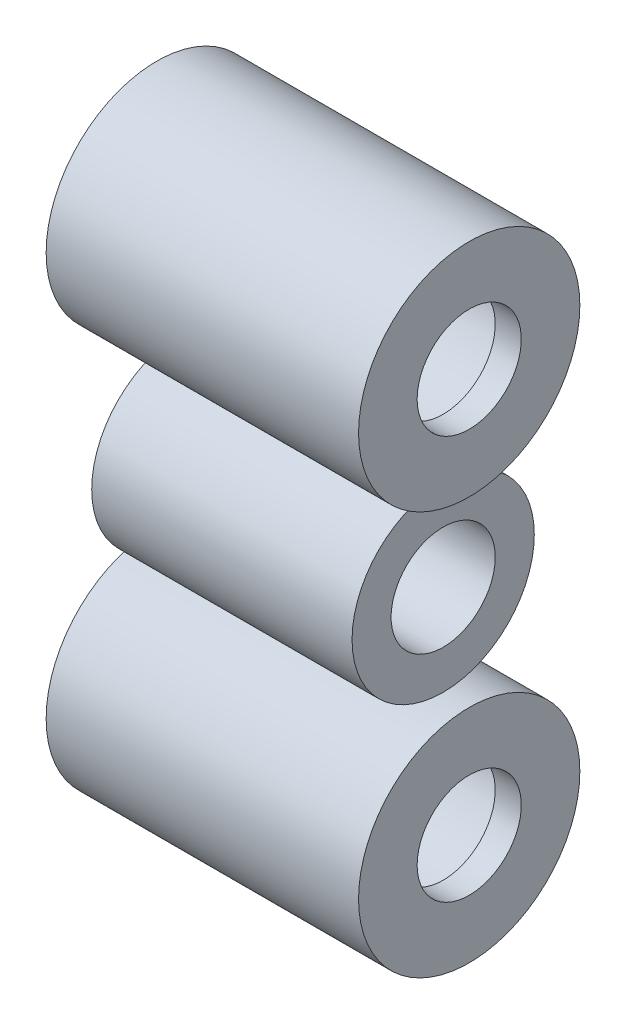
ISO-10303-21;
HEADER;
FILE_DESCRIPTION(('STEP AP214'),'2;1');
FILE_NAME('part.step','',(''),(''),'','','');
FILE_SCHEMA(('AUTOMOTIVE_DESIGN { 1 0 10303 214 1 1 1 1 }'));
ENDSEC;
DATA;
#1=APPLICATION_CONTEXT('core data for automotive mechanical design processes');
#2=APPLICATION_PROTOCOL_DEFINITION('international standard','automotive_design',2000,#1);
#3=PRODUCT_CONTEXT('',#1,'mechanical');
#4=PRODUCT('Part','Part','',(#3));
#5=PRODUCT_RELATED_PRODUCT_CATEGORY('part','',(#4));
#6=PRODUCT_DEFINITION_FORMATION('','',#4);
#7=PRODUCT_DEFINITION_CONTEXT('part definition',#1,'design');
#8=PRODUCT_DEFINITION('design','',#6,#7);
#9=PRODUCT_DEFINITION_SHAPE('','',#8);
#10=(LENGTH_UNIT() NAMED_UNIT(*) SI_UNIT(.MILLI.,.METRE.));
#11=(NAMED_UNIT(*) PLANE_ANGLE_UNIT() SI_UNIT($,.RADIAN.));
#12=(NAMED_UNIT(*) SI_UNIT($,.STERADIAN.) SOLID_ANGLE_UNIT());
#13=UNCERTAINTY_MEASURE_WITH_UNIT(LENGTH_MEASURE(1.E-05),#10,'distance_accuracy_value','');
#14=(GEOMETRIC_REPRESENTATION_CONTEXT(3) GLOBAL_UNCERTAINTY_ASSIGNED_CONTEXT((#13)) GLOBAL_UNIT_ASSIGNED_CONTEXT((#10,
#11,#12)) REPRESENTATION_CONTEXT('',''));
#15=CARTESIAN_POINT('',(0.,0.,0.));
#16=DIRECTION('',(0.,0.,1.));
#17=DIRECTION('',(1.,0.,0.));
#18=AXIS2_PLACEMENT_3D('',#15,#16,#17);
#19=CARTESIAN_POINT('',(-12.,-19.5,0.));
#20=DIRECTION('',(-1.,0.,0.));
#21=DIRECTION('',(0.,0.,1.));
#22=AXIS2_PLACEMENT_3D('',#19,#20,#21);
#23=PLANE('',#22);
#24=CARTESIAN_POINT('',(-12.,-15.5,0.));
#25=DIRECTION('',(-1.,0.,0.));
#26=DIRECTION('',(0.,0.,1.));
#27=AXIS2_PLACEMENT_3D('',#24,#25,#26);
#28=CIRCLE('',#27,8.5);
#29=CARTESIAN_POINT('',(-12.,-15.5,8.5));
#30=VERTEX_POINT('',#29);
#31=EDGE_CURVE('E11',#30,#30,#28,.T.);
#32=ORIENTED_EDGE('',*,*,#31,.T.);
#33=EDGE_LOOP('',(#32));
#34=FACE_BOUND('',#33,.T.);
#35=CARTESIAN_POINT('',(-12.,-15.5,0.));
#36=DIRECTION('',(-1.,0.,0.));
#37=DIRECTION('',(0.,0.,1.));
#38=AXIS2_PLACEMENT_3D('',#35,#36,#37);
#39=CIRCLE('',#38,4.);
#40=CARTESIAN_POINT('',(-12.,-15.5,4.));
#41=VERTEX_POINT('',#40);
#42=EDGE_CURVE('E68',#41,#41,#39,.T.);
#43=ORIENTED_EDGE('',*,*,#42,.F.);
#44=EDGE_LOOP('',(#43));
#45=FACE_BOUND('',#44,.T.);
#46=ADVANCED_FACE('F40',(#34,#45),#23,.T.);
#47=CARTESIAN_POINT('',(-16.9103183532262,-15.5,0.));
#48=DIRECTION('',(-1.,0.,0.));
#49=DIRECTION('',(0.,0.,1.));
#50=AXIS2_PLACEMENT_3D('',#47,#48,#49);
#51=CYLINDRICAL_SURFACE('',#50,8.5);
#52=CARTESIAN_POINT('',(12.,-15.5,0.));
#53=DIRECTION('',(-1.,0.,0.));
#54=DIRECTION('',(0.,0.,1.));
#55=AXIS2_PLACEMENT_3D('',#52,#53,#54);
#56=CIRCLE('',#55,8.5);
#57=CARTESIAN_POINT('',(12.,-15.5,8.5));
#58=VERTEX_POINT('',#57);
#59=EDGE_CURVE('E46',#58,#58,#56,.T.);
#60=ORIENTED_EDGE('',*,*,#59,.T.);
#61=EDGE_LOOP('',(#60));
#62=FACE_BOUND('',#61,.T.);
#63=ORIENTED_EDGE('',*,*,#31,.F.);
#64=EDGE_LOOP('',(#63));
#65=FACE_BOUND('',#64,.T.);
#66=ADVANCED_FACE('F76',(#62,#65),#51,.T.);
#67=CARTESIAN_POINT('',(12.,-24.,0.));
#68=DIRECTION('',(1.,0.,0.));
#69=DIRECTION('',(0.,0.,-1.));
#70=AXIS2_PLACEMENT_3D('',#67,#68,#69);
#71=PLANE('',#70);
#72=CARTESIAN_POINT('',(12.,-15.5,0.));
#73=DIRECTION('',(-1.,0.,0.));
#74=DIRECTION('',(0.,0.,1.));
#75=AXIS2_PLACEMENT_3D('',#72,#73,#74);
#76=CIRCLE('',#75,3.99999999999999);
#77=CARTESIAN_POINT('',(12.,-15.5,3.99999999999999));
#78=VERTEX_POINT('',#77);
#79=EDGE_CURVE('E50',#78,#78,#76,.T.);
#80=ORIENTED_EDGE('',*,*,#79,.T.);
#81=EDGE_LOOP('',(#80));
#82=FACE_BOUND('',#81,.T.);
#83=ORIENTED_EDGE('',*,*,#59,.F.);
#84=EDGE_LOOP('',(#83));
#85=FACE_BOUND('',#84,.T.);
#86=ADVANCED_FACE('F80',(#82,#85),#71,.T.);
#87=CARTESIAN_POINT('',(-16.9103183532262,-15.5,0.));
#88=DIRECTION('',(-1.,0.,0.));
#89=DIRECTION('',(0.,0.,1.));
#90=AXIS2_PLACEMENT_3D('',#87,#88,#89);
#91=CYLINDRICAL_SURFACE('',#90,3.99999999999999);
#92=CARTESIAN_POINT('',(10.,-15.5,0.));
#93=DIRECTION('',(-1.,0.,0.));
#94=DIRECTION('',(0.,0.,1.));
#95=AXIS2_PLACEMENT_3D('',#92,#93,#94);
#96=CIRCLE('',#95,3.99999999999999);
#97=CARTESIAN_POINT('',(10.,-15.5,3.99999999999999));
#98=VERTEX_POINT('',#97);
#99=EDGE_CURVE('E54',#98,#98,#96,.T.);
#100=ORIENTED_EDGE('',*,*,#99,.T.);
#101=EDGE_LOOP('',(#100));
#102=FACE_BOUND('',#101,.T.);
#103=ORIENTED_EDGE('',*,*,#79,.F.);
#104=EDGE_LOOP('',(#103));
#105=FACE_BOUND('',#104,.T.);
#106=ADVANCED_FACE('F84',(#102,#105),#91,.F.);
#107=CARTESIAN_POINT('',(10.,-19.5,0.));
#108=DIRECTION('',(-1.,0.,0.));
#109=DIRECTION('',(0.,0.,1.));
#110=AXIS2_PLACEMENT_3D('',#107,#108,#109);
#111=PLANE('',#110);
#112=CARTESIAN_POINT('',(10.,-15.5,0.));
#113=DIRECTION('',(-1.,0.,0.));
#114=DIRECTION('',(0.,0.,1.));
#115=AXIS2_PLACEMENT_3D('',#112,#113,#114);
#116=CIRCLE('',#115,6.5);
#117=CARTESIAN_POINT('',(10.,-15.5,6.5));
#118=VERTEX_POINT('',#117);
#119=EDGE_CURVE('E59',#118,#118,#116,.T.);
#120=ORIENTED_EDGE('',*,*,#119,.T.);
#121=EDGE_LOOP('',(#120));
#122=FACE_BOUND('',#121,.T.);
#123=ORIENTED_EDGE('',*,*,#99,.F.);
#124=EDGE_LOOP('',(#123));
#125=FACE_BOUND('',#124,.T.);
#126=ADVANCED_FACE('F91',(#122,#125),#111,.T.);
#127=CARTESIAN_POINT('',(-16.9103183532262,-15.5,0.));
#128=DIRECTION('',(-1.,0.,0.));
#129=DIRECTION('',(0.,0.,1.));
#130=AXIS2_PLACEMENT_3D('',#127,#128,#129);
#131=CYLINDRICAL_SURFACE('',#130,6.5);
#132=CARTESIAN_POINT('',(-9.99999999999999,-15.5,0.));
#133=DIRECTION('',(-1.,0.,0.));
#134=DIRECTION('',(0.,0.,1.));
#135=AXIS2_PLACEMENT_3D('',#132,#133,#134);
#136=CIRCLE('',#135,6.5);
#137=CARTESIAN_POINT('',(-9.99999999999999,-15.5,6.5));
#138=VERTEX_POINT('',#137);
#139=EDGE_CURVE('E62',#138,#138,#136,.T.);
#140=ORIENTED_EDGE('',*,*,#139,.T.);
#141=EDGE_LOOP('',(#140));
#142=FACE_BOUND('',#141,.T.);
#143=ORIENTED_EDGE('',*,*,#119,.F.);
#144=EDGE_LOOP('',(#143));
#145=FACE_BOUND('',#144,.T.);
#146=ADVANCED_FACE('F95',(#142,#145),#131,.F.);
#147=CARTESIAN_POINT('',(-9.99999999999999,-22.,0.));
#148=DIRECTION('',(1.,0.,0.));
#149=DIRECTION('',(0.,0.,-1.));
#150=AXIS2_PLACEMENT_3D('',#147,#148,#149);
#151=PLANE('',#150);
#152=CARTESIAN_POINT('',(-9.99999999999999,-15.5,0.));
#153=DIRECTION('',(-1.,0.,0.));
#154=DIRECTION('',(0.,0.,1.));
#155=AXIS2_PLACEMENT_3D('',#152,#153,#154);
#156=CIRCLE('',#155,4.);
#157=CARTESIAN_POINT('',(-9.99999999999999,-15.5,4.));
#158=VERTEX_POINT('',#157);
#159=EDGE_CURVE('E65',#158,#158,#156,.T.);
#160=ORIENTED_EDGE('',*,*,#159,.T.);
#161=EDGE_LOOP('',(#160));
#162=FACE_BOUND('',#161,.T.);
#163=ORIENTED_EDGE('',*,*,#139,.F.);
#164=EDGE_LOOP('',(#163));
#165=FACE_BOUND('',#164,.T.);
#166=ADVANCED_FACE('F99',(#162,#165),#151,.T.);
#167=CARTESIAN_POINT('',(-16.9103183532262,-15.5,0.));
#168=DIRECTION('',(-1.,0.,0.));
#169=DIRECTION('',(0.,0.,1.));
#170=AXIS2_PLACEMENT_3D('',#167,#168,#169);
#171=CYLINDRICAL_SURFACE('',#170,4.);
#172=ORIENTED_EDGE('',*,*,#42,.T.);
#173=EDGE_LOOP('',(#172));
#174=FACE_BOUND('',#173,.T.);
#175=ORIENTED_EDGE('',*,*,#159,.F.);
#176=EDGE_LOOP('',(#175));
#177=FACE_BOUND('',#176,.T.);
#178=ADVANCED_FACE('F72',(#174,#177),#171,.F.);
#179=CLOSED_SHELL('',(#46,#66,#86,#106,#126,#146,#166,#178));
#180=MANIFOLD_SOLID_BREP('B2',#179);
#181=CARTESIAN_POINT('',(-12.,19.5,0.));
#182=DIRECTION('',(1.,0.,0.));
#183=DIRECTION('',(0.,0.,-1.));
#184=AXIS2_PLACEMENT_3D('',#181,#182,#183);
#185=PLANE('',#184);
#186=CARTESIAN_POINT('',(-12.,15.5,0.));
#187=DIRECTION('',(-1.,0.,0.));
#188=DIRECTION('',(0.,0.,1.));
#189=AXIS2_PLACEMENT_3D('',#186,#187,#188);
#190=CIRCLE('',#189,3.99999999999999);
#191=CARTESIAN_POINT('',(-12.,15.5,3.99999999999999));
#192=VERTEX_POINT('',#191);
#193=EDGE_CURVE('E197',#192,#192,#190,.T.);
#194=ORIENTED_EDGE('',*,*,#193,.F.);
#195=EDGE_LOOP('',(#194));
#196=FACE_BOUND('',#195,.T.);
#197=CARTESIAN_POINT('',(-12.,15.5,0.));
#198=DIRECTION('',(-1.,0.,0.));
#199=DIRECTION('',(0.,0.,1.));
#200=AXIS2_PLACEMENT_3D('',#197,#198,#199);
#201=CIRCLE('',#200,8.5);
#202=CARTESIAN_POINT('',(-12.,15.5,8.5));
#203=VERTEX_POINT('',#202);
#204=EDGE_CURVE('E39',#203,#203,#201,.T.);
#205=ORIENTED_EDGE('',*,*,#204,.T.);
#206=EDGE_LOOP('',(#205));
#207=FACE_BOUND('',#206,.T.);
#208=ADVANCED_FACE('F169',(#196,#207),#185,.F.);
#209=CARTESIAN_POINT('',(-16.9103183532262,15.5,0.));
#210=DIRECTION('',(-1.,0.,0.));
#211=DIRECTION('',(0.,0.,1.));
#212=AXIS2_PLACEMENT_3D('',#209,#210,#211);
#213=CYLINDRICAL_SURFACE('',#212,8.5);
#214=ORIENTED_EDGE('',*,*,#204,.F.);
#215=EDGE_LOOP('',(#214));
#216=FACE_BOUND('',#215,.T.);
#217=CARTESIAN_POINT('',(12.,15.5,0.));
#218=DIRECTION('',(-1.,0.,0.));
#219=DIRECTION('',(0.,0.,1.));
#220=AXIS2_PLACEMENT_3D('',#217,#218,#219);
#221=CIRCLE('',#220,8.5);
#222=CARTESIAN_POINT('',(12.,15.5,8.5));
#223=VERTEX_POINT('',#222);
#224=EDGE_CURVE('E175',#223,#223,#221,.T.);
#225=ORIENTED_EDGE('',*,*,#224,.T.);
#226=EDGE_LOOP('',(#225));
#227=FACE_BOUND('',#226,.T.);
#228=ADVANCED_FACE('F204',(#216,#227),#213,.T.);
#229=CARTESIAN_POINT('',(12.,24.,0.));
#230=DIRECTION('',(-1.,0.,0.));
#231=DIRECTION('',(0.,0.,1.));
#232=AXIS2_PLACEMENT_3D('',#229,#230,#231);
#233=PLANE('',#232);
#234=ORIENTED_EDGE('',*,*,#224,.F.);
#235=EDGE_LOOP('',(#234));
#236=FACE_BOUND('',#235,.T.);
#237=CARTESIAN_POINT('',(12.,15.5,0.));
#238=DIRECTION('',(-1.,0.,0.));
#239=DIRECTION('',(0.,0.,1.));
#240=AXIS2_PLACEMENT_3D('',#237,#238,#239);
#241=CIRCLE('',#240,4.);
#242=CARTESIAN_POINT('',(12.,15.5,4.));
#243=VERTEX_POINT('',#242);
#244=EDGE_CURVE('E179',#243,#243,#241,.T.);
#245=ORIENTED_EDGE('',*,*,#244,.T.);
#246=EDGE_LOOP('',(#245));
#247=FACE_BOUND('',#246,.T.);
#248=ADVANCED_FACE('F208',(#236,#247),#233,.F.);
#249=CARTESIAN_POINT('',(-16.9103183532262,15.5,0.));
#250=DIRECTION('',(-1.,0.,0.));
#251=DIRECTION('',(0.,0.,1.));
#252=AXIS2_PLACEMENT_3D('',#249,#250,#251);
#253=CYLINDRICAL_SURFACE('',#252,4.);
#254=ORIENTED_EDGE('',*,*,#244,.F.);
#255=EDGE_LOOP('',(#254));
#256=FACE_BOUND('',#255,.T.);
#257=CARTESIAN_POINT('',(10.,15.5,0.));
#258=DIRECTION('',(-1.,0.,0.));
#259=DIRECTION('',(0.,0.,1.));
#260=AXIS2_PLACEMENT_3D('',#257,#258,#259);
#261=CIRCLE('',#260,4.);
#262=CARTESIAN_POINT('',(10.,15.5,4.));
#263=VERTEX_POINT('',#262);
#264=EDGE_CURVE('E183',#263,#263,#261,.T.);
#265=ORIENTED_EDGE('',*,*,#264,.T.);
#266=EDGE_LOOP('',(#265));
#267=FACE_BOUND('',#266,.T.);
#268=ADVANCED_FACE('F213',(#256,#267),#253,.F.);
#269=CARTESIAN_POINT('',(10.,19.5,0.));
#270=DIRECTION('',(1.,0.,0.));
#271=DIRECTION('',(0.,0.,-1.));
#272=AXIS2_PLACEMENT_3D('',#269,#270,#271);
#273=PLANE('',#272);
#274=ORIENTED_EDGE('',*,*,#264,.F.);
#275=EDGE_LOOP('',(#274));
#276=FACE_BOUND('',#275,.T.);
#277=CARTESIAN_POINT('',(10.,15.5,0.));
#278=DIRECTION('',(-1.,0.,0.));
#279=DIRECTION('',(0.,0.,1.));
#280=AXIS2_PLACEMENT_3D('',#277,#278,#279);
#281=CIRCLE('',#280,6.5);
#282=CARTESIAN_POINT('',(10.,15.5,6.5));
#283=VERTEX_POINT('',#282);
#284=EDGE_CURVE('E188',#283,#283,#281,.T.);
#285=ORIENTED_EDGE('',*,*,#284,.T.);
#286=EDGE_LOOP('',(#285));
#287=FACE_BOUND('',#286,.T.);
#288=ADVANCED_FACE('F219',(#276,#287),#273,.F.);
#289=CARTESIAN_POINT('',(-16.9103183532262,15.5,0.));
#290=DIRECTION('',(-1.,0.,0.));
#291=DIRECTION('',(0.,0.,1.));
#292=AXIS2_PLACEMENT_3D('',#289,#290,#291);
#293=CYLINDRICAL_SURFACE('',#292,6.5);
#294=ORIENTED_EDGE('',*,*,#284,.F.);
#295=EDGE_LOOP('',(#294));
#296=FACE_BOUND('',#295,.T.);
#297=CARTESIAN_POINT('',(-10.,15.5,0.));
#298=DIRECTION('',(-1.,0.,0.));
#299=DIRECTION('',(0.,0.,1.));
#300=AXIS2_PLACEMENT_3D('',#297,#298,#299);
#301=CIRCLE('',#300,6.5);
#302=CARTESIAN_POINT('',(-10.,15.5,6.5));
#303=VERTEX_POINT('',#302);
#304=EDGE_CURVE('E191',#303,#303,#301,.T.);
#305=ORIENTED_EDGE('',*,*,#304,.T.);
#306=EDGE_LOOP('',(#305));
#307=FACE_BOUND('',#306,.T.);
#308=ADVANCED_FACE('F223',(#296,#307),#293,.F.);
#309=CARTESIAN_POINT('',(-10.,22.,0.));
#310=DIRECTION('',(-1.,0.,0.));
#311=DIRECTION('',(0.,0.,1.));
#312=AXIS2_PLACEMENT_3D('',#309,#310,#311);
#313=PLANE('',#312);
#314=ORIENTED_EDGE('',*,*,#304,.F.);
#315=EDGE_LOOP('',(#314));
#316=FACE_BOUND('',#315,.T.);
#317=CARTESIAN_POINT('',(-10.,15.5,0.));
#318=DIRECTION('',(-1.,0.,0.));
#319=DIRECTION('',(0.,0.,1.));
#320=AXIS2_PLACEMENT_3D('',#317,#318,#319);
#321=CIRCLE('',#320,4.);
#322=CARTESIAN_POINT('',(-10.,15.5,4.));
#323=VERTEX_POINT('',#322);
#324=EDGE_CURVE('E194',#323,#323,#321,.T.);
#325=ORIENTED_EDGE('',*,*,#324,.T.);
#326=EDGE_LOOP('',(#325));
#327=FACE_BOUND('',#326,.T.);
#328=ADVANCED_FACE('F227',(#316,#327),#313,.F.);
#329=CARTESIAN_POINT('',(-16.9103183532262,15.5,0.));
#330=DIRECTION('',(-1.,0.,0.));
#331=DIRECTION('',(0.,0.,1.));
#332=AXIS2_PLACEMENT_3D('',#329,#330,#331);
#333=CYLINDRICAL_SURFACE('',#332,3.99999999999999);
#334=ORIENTED_EDGE('',*,*,#324,.F.);
#335=EDGE_LOOP('',(#334));
#336=FACE_BOUND('',#335,.T.);
#337=ORIENTED_EDGE('',*,*,#193,.T.);
#338=EDGE_LOOP('',(#337));
#339=FACE_BOUND('',#338,.T.);
#340=ADVANCED_FACE('F201',(#336,#339),#333,.F.);
#341=CLOSED_SHELL('',(#208,#228,#248,#268,#288,#308,#328,#340));
#342=MANIFOLD_SOLID_BREP('B6',#341);
#343=CARTESIAN_POINT('',(10.,0.,0.));
#344=DIRECTION('',(1.,0.,0.));
#345=DIRECTION('',(0.,0.,-1.));
#346=AXIS2_PLACEMENT_3D('',#343,#344,#345);
#347=PLANE('',#346);
#348=CARTESIAN_POINT('',(10.,0.,0.));
#349=DIRECTION('',(1.,0.,0.));
#350=DIRECTION('',(0.,0.,-1.));
#351=AXIS2_PLACEMENT_3D('',#348,#349,#350);
#352=CIRCLE('',#351,7.);
#353=CARTESIAN_POINT('',(10.,0.,-7.));
#354=VERTEX_POINT('',#353);
#355=EDGE_CURVE('E168',#354,#354,#352,.T.);
#356=ORIENTED_EDGE('',*,*,#355,.T.);
#357=EDGE_LOOP('',(#356));
#358=FACE_BOUND('',#357,.T.);
#359=CARTESIAN_POINT('',(10.,0.,0.));
#360=DIRECTION('',(1.,0.,0.));
#361=DIRECTION('',(0.,0.,-1.));
#362=AXIS2_PLACEMENT_3D('',#359,#360,#361);
#363=CIRCLE('',#362,4.);
#364=CARTESIAN_POINT('',(10.,0.,-4.));
#365=VERTEX_POINT('',#364);
#366=EDGE_CURVE('E302',#365,#365,#363,.T.);
#367=ORIENTED_EDGE('',*,*,#366,.F.);
#368=EDGE_LOOP('',(#367));
#369=FACE_BOUND('',#368,.T.);
#370=ADVANCED_FACE('F291',(#358,#369),#347,.T.);
#371=CARTESIAN_POINT('',(-10.,0.,0.));
#372=DIRECTION('',(1.,0.,0.));
#373=DIRECTION('',(0.,0.,-1.));
#374=AXIS2_PLACEMENT_3D('',#371,#372,#373);
#375=PLANE('',#374);
#376=CARTESIAN_POINT('',(-10.,0.,0.));
#377=DIRECTION('',(1.,0.,0.));
#378=DIRECTION('',(0.,0.,-1.));
#379=AXIS2_PLACEMENT_3D('',#376,#377,#378);
#380=CIRCLE('',#379,7.);
#381=CARTESIAN_POINT('',(-10.,0.,-7.));
#382=VERTEX_POINT('',#381);
#383=EDGE_CURVE('E295',#382,#382,#380,.T.);
#384=ORIENTED_EDGE('',*,*,#383,.F.);
#385=EDGE_LOOP('',(#384));
#386=FACE_BOUND('',#385,.T.);
#387=CARTESIAN_POINT('',(-10.,0.,0.));
#388=DIRECTION('',(1.,0.,0.));
#389=DIRECTION('',(0.,0.,-1.));
#390=AXIS2_PLACEMENT_3D('',#387,#388,#389);
#391=CIRCLE('',#390,4.);
#392=CARTESIAN_POINT('',(-10.,0.,-4.));
#393=VERTEX_POINT('',#392);
#394=EDGE_CURVE('E304',#393,#393,#391,.T.);
#395=ORIENTED_EDGE('',*,*,#394,.T.);
#396=EDGE_LOOP('',(#395));
#397=FACE_BOUND('',#396,.T.);
#398=ADVANCED_FACE('F314',(#386,#397),#375,.F.);
#399=CARTESIAN_POINT('',(10.,0.,0.));
#400=DIRECTION('',(-1.,0.,0.));
#401=DIRECTION('',(0.,0.,1.));
#402=AXIS2_PLACEMENT_3D('',#399,#400,#401);
#403=CYLINDRICAL_SURFACE('',#402,7.);
#404=ORIENTED_EDGE('',*,*,#383,.T.);
#405=EDGE_LOOP('',(#404));
#406=FACE_BOUND('',#405,.T.);
#407=ORIENTED_EDGE('',*,*,#355,.F.);
#408=EDGE_LOOP('',(#407));
#409=FACE_BOUND('',#408,.T.);
#410=ADVANCED_FACE('F293',(#406,#409),#403,.T.);
#411=CARTESIAN_POINT('',(10.,0.,0.));
#412=DIRECTION('',(-1.,0.,0.));
#413=DIRECTION('',(0.,0.,1.));
#414=AXIS2_PLACEMENT_3D('',#411,#412,#413);
#415=CYLINDRICAL_SURFACE('',#414,4.);
#416=ORIENTED_EDGE('',*,*,#366,.T.);
#417=EDGE_LOOP('',(#416));
#418=FACE_BOUND('',#417,.T.);
#419=ORIENTED_EDGE('',*,*,#394,.F.);
#420=EDGE_LOOP('',(#419));
#421=FACE_BOUND('',#420,.T.);
#422=ADVANCED_FACE('F310',(#418,#421),#415,.F.);
#423=CLOSED_SHELL('',(#370,#398,#410,#422));
#424=MANIFOLD_SOLID_BREP('B34',#423);
#425=ADVANCED_BREP_SHAPE_REPRESENTATION('',(#18,#180,#342,#424),#14);
#426=SHAPE_DEFINITION_REPRESENTATION(#9,#425);
ENDSEC;
END-ISO-10303-21;
